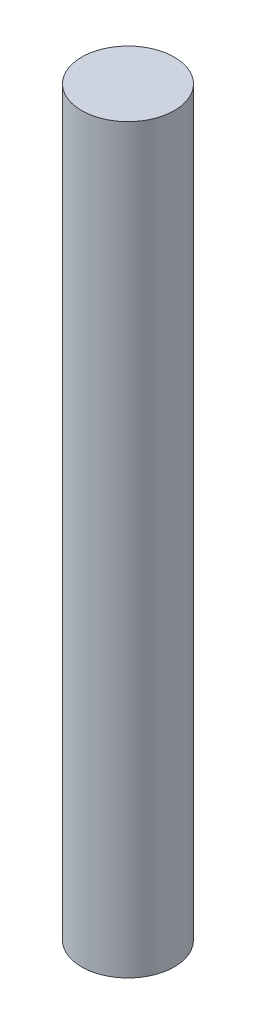
ISO-10303-21;
HEADER;
FILE_DESCRIPTION(('STEP AP214'),'2;1');
FILE_NAME('part.step','',(''),(''),'','','');
FILE_SCHEMA(('AUTOMOTIVE_DESIGN { 1 0 10303 214 1 1 1 1 }'));
ENDSEC;
DATA;
#1=APPLICATION_CONTEXT('core data for automotive mechanical design processes');
#2=APPLICATION_PROTOCOL_DEFINITION('international standard','automotive_design',2000,#1);
#3=PRODUCT_CONTEXT('',#1,'mechanical');
#4=PRODUCT('Part','Part','',(#3));
#5=PRODUCT_RELATED_PRODUCT_CATEGORY('part','',(#4));
#6=PRODUCT_DEFINITION_FORMATION('','',#4);
#7=PRODUCT_DEFINITION_CONTEXT('part definition',#1,'design');
#8=PRODUCT_DEFINITION('design','',#6,#7);
#9=PRODUCT_DEFINITION_SHAPE('','',#8);
#10=(LENGTH_UNIT() NAMED_UNIT(*) SI_UNIT(.MILLI.,.METRE.));
#11=(NAMED_UNIT(*) PLANE_ANGLE_UNIT() SI_UNIT($,.RADIAN.));
#12=(NAMED_UNIT(*) SI_UNIT($,.STERADIAN.) SOLID_ANGLE_UNIT());
#13=UNCERTAINTY_MEASURE_WITH_UNIT(LENGTH_MEASURE(1.E-05),#10,'distance_accuracy_value','');
#14=(GEOMETRIC_REPRESENTATION_CONTEXT(3) GLOBAL_UNCERTAINTY_ASSIGNED_CONTEXT((#13)) GLOBAL_UNIT_ASSIGNED_CONTEXT((#10,
#11,#12)) REPRESENTATION_CONTEXT('',''));
#15=CARTESIAN_POINT('',(0.,0.,0.));
#16=DIRECTION('',(0.,0.,1.));
#17=DIRECTION('',(1.,0.,0.));
#18=AXIS2_PLACEMENT_3D('',#15,#16,#17);
#19=CARTESIAN_POINT('',(0.,40.,0.));
#20=DIRECTION('',(0.,-1.,0.));
#21=DIRECTION('',(0.,0.,-1.));
#22=AXIS2_PLACEMENT_3D('',#19,#20,#21);
#23=CYLINDRICAL_SURFACE('',#22,2.5);
#24=CARTESIAN_POINT('',(0.,40.,0.));
#25=DIRECTION('',(0.,1.,0.));
#26=DIRECTION('',(0.,0.,1.));
#27=AXIS2_PLACEMENT_3D('',#24,#25,#26);
#28=CIRCLE('',#27,2.5);
#29=CARTESIAN_POINT('',(0.,40.,2.5));
#30=VERTEX_POINT('',#29);
#31=EDGE_CURVE('E10',#30,#30,#28,.T.);
#32=ORIENTED_EDGE('',*,*,#31,.F.);
#33=EDGE_LOOP('',(#32));
#34=FACE_BOUND('',#33,.T.);
#35=CARTESIAN_POINT('',(0.,0.,0.));
#36=DIRECTION('',(0.,1.,0.));
#37=DIRECTION('',(0.,0.,1.));
#38=AXIS2_PLACEMENT_3D('',#35,#36,#37);
#39=CIRCLE('',#38,2.5);
#40=CARTESIAN_POINT('',(0.,0.,2.5));
#41=VERTEX_POINT('',#40);
#42=EDGE_CURVE('E44',#41,#41,#39,.T.);
#43=ORIENTED_EDGE('',*,*,#42,.T.);
#44=EDGE_LOOP('',(#43));
#45=FACE_BOUND('',#44,.T.);
#46=ADVANCED_FACE('F41',(#34,#45),#23,.T.);
#47=CARTESIAN_POINT('',(0.,40.,0.));
#48=DIRECTION('',(0.,1.,0.));
#49=DIRECTION('',(0.,0.,1.));
#50=AXIS2_PLACEMENT_3D('',#47,#48,#49);
#51=PLANE('',#50);
#52=ORIENTED_EDGE('',*,*,#31,.T.);
#53=EDGE_LOOP('',(#52));
#54=FACE_BOUND('',#53,.T.);
#55=ADVANCED_FACE('F58',(#54),#51,.T.);
#56=CARTESIAN_POINT('',(0.,0.,0.));
#57=DIRECTION('',(0.,1.,0.));
#58=DIRECTION('',(0.,0.,1.));
#59=AXIS2_PLACEMENT_3D('',#56,#57,#58);
#60=PLANE('',#59);
#61=ORIENTED_EDGE('',*,*,#42,.F.);
#62=EDGE_LOOP('',(#61));
#63=FACE_BOUND('',#62,.T.);
#64=ADVANCED_FACE('F56',(#63),#60,.F.);
#65=CLOSED_SHELL('',(#46,#55,#64));
#66=MANIFOLD_SOLID_BREP('B2',#65);
#67=ADVANCED_BREP_SHAPE_REPRESENTATION('',(#18,#66),#14);
#68=SHAPE_DEFINITION_REPRESENTATION(#9,#67);
ENDSEC;
END-ISO-10303-21;
